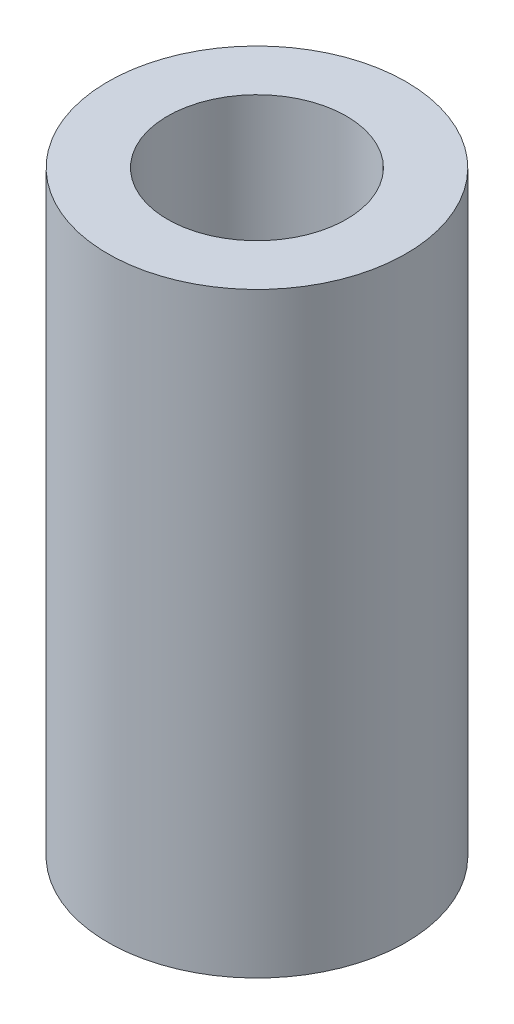
ISO-10303-21;
HEADER;
FILE_DESCRIPTION(('STEP AP214'),'2;1');
FILE_NAME('part.step','',(''),(''),'','','');
FILE_SCHEMA(('AUTOMOTIVE_DESIGN { 1 0 10303 214 1 1 1 1 }'));
ENDSEC;
DATA;
#1=APPLICATION_CONTEXT('core data for automotive mechanical design processes');
#2=APPLICATION_PROTOCOL_DEFINITION('international standard','automotive_design',2000,#1);
#3=PRODUCT_CONTEXT('',#1,'mechanical');
#4=PRODUCT('Part','Part','',(#3));
#5=PRODUCT_RELATED_PRODUCT_CATEGORY('part','',(#4));
#6=PRODUCT_DEFINITION_FORMATION('','',#4);
#7=PRODUCT_DEFINITION_CONTEXT('part definition',#1,'design');
#8=PRODUCT_DEFINITION('design','',#6,#7);
#9=PRODUCT_DEFINITION_SHAPE('','',#8);
#10=(LENGTH_UNIT() NAMED_UNIT(*) SI_UNIT(.MILLI.,.METRE.));
#11=(NAMED_UNIT(*) PLANE_ANGLE_UNIT() SI_UNIT($,.RADIAN.));
#12=(NAMED_UNIT(*) SI_UNIT($,.STERADIAN.) SOLID_ANGLE_UNIT());
#13=UNCERTAINTY_MEASURE_WITH_UNIT(LENGTH_MEASURE(1.E-05),#10,'distance_accuracy_value','');
#14=(GEOMETRIC_REPRESENTATION_CONTEXT(3) GLOBAL_UNCERTAINTY_ASSIGNED_CONTEXT((#13)) GLOBAL_UNIT_ASSIGNED_CONTEXT((#10,
#11,#12)) REPRESENTATION_CONTEXT('',''));
#15=CARTESIAN_POINT('',(0.,0.,0.));
#16=DIRECTION('',(0.,0.,1.));
#17=DIRECTION('',(1.,0.,0.));
#18=AXIS2_PLACEMENT_3D('',#15,#16,#17);
#19=CARTESIAN_POINT('',(0.,0.,0.));
#20=DIRECTION('',(0.,-1.,0.));
#21=DIRECTION('',(0.,0.,-1.));
#22=AXIS2_PLACEMENT_3D('',#19,#20,#21);
#23=CYLINDRICAL_SURFACE('',#22,1.5);
#24=CARTESIAN_POINT('',(0.,10.,0.));
#25=DIRECTION('',(0.,-1.,0.));
#26=DIRECTION('',(0.,0.,-1.));
#27=AXIS2_PLACEMENT_3D('',#24,#25,#26);
#28=CIRCLE('',#27,1.5);
#29=CARTESIAN_POINT('',(0.,10.,-1.5));
#30=VERTEX_POINT('',#29);
#31=EDGE_CURVE('E10',#30,#30,#28,.T.);
#32=ORIENTED_EDGE('',*,*,#31,.F.);
#33=EDGE_LOOP('',(#32));
#34=FACE_BOUND('',#33,.T.);
#35=CARTESIAN_POINT('',(0.,0.,0.));
#36=DIRECTION('',(0.,-1.,0.));
#37=DIRECTION('',(0.,0.,-1.));
#38=AXIS2_PLACEMENT_3D('',#35,#36,#37);
#39=CIRCLE('',#38,1.5);
#40=CARTESIAN_POINT('',(0.,0.,-1.5));
#41=VERTEX_POINT('',#40);
#42=EDGE_CURVE('E44',#41,#41,#39,.T.);
#43=ORIENTED_EDGE('',*,*,#42,.T.);
#44=EDGE_LOOP('',(#43));
#45=FACE_BOUND('',#44,.T.);
#46=ADVANCED_FACE('F30',(#34,#45),#23,.F.);
#47=CARTESIAN_POINT('',(-1.5,10.,0.));
#48=DIRECTION('',(0.,-1.,0.));
#49=DIRECTION('',(0.,0.,-1.));
#50=AXIS2_PLACEMENT_3D('',#47,#48,#49);
#51=PLANE('',#50);
#52=CARTESIAN_POINT('',(0.,10.,0.));
#53=DIRECTION('',(0.,-1.,0.));
#54=DIRECTION('',(0.,0.,-1.));
#55=AXIS2_PLACEMENT_3D('',#52,#53,#54);
#56=CIRCLE('',#55,2.5);
#57=CARTESIAN_POINT('',(0.,10.,-2.5));
#58=VERTEX_POINT('',#57);
#59=EDGE_CURVE('E36',#58,#58,#56,.T.);
#60=ORIENTED_EDGE('',*,*,#59,.F.);
#61=EDGE_LOOP('',(#60));
#62=FACE_BOUND('',#61,.T.);
#63=ORIENTED_EDGE('',*,*,#31,.T.);
#64=EDGE_LOOP('',(#63));
#65=FACE_BOUND('',#64,.T.);
#66=ADVANCED_FACE('F59',(#62,#65),#51,.F.);
#67=CARTESIAN_POINT('',(0.,0.,0.));
#68=DIRECTION('',(0.,-1.,0.));
#69=DIRECTION('',(0.,0.,-1.));
#70=AXIS2_PLACEMENT_3D('',#67,#68,#69);
#71=CYLINDRICAL_SURFACE('',#70,2.5);
#72=CARTESIAN_POINT('',(0.,0.,0.));
#73=DIRECTION('',(0.,-1.,0.));
#74=DIRECTION('',(0.,0.,-1.));
#75=AXIS2_PLACEMENT_3D('',#72,#73,#74);
#76=CIRCLE('',#75,2.5);
#77=CARTESIAN_POINT('',(0.,0.,-2.5));
#78=VERTEX_POINT('',#77);
#79=EDGE_CURVE('E40',#78,#78,#76,.T.);
#80=ORIENTED_EDGE('',*,*,#79,.F.);
#81=EDGE_LOOP('',(#80));
#82=FACE_BOUND('',#81,.T.);
#83=ORIENTED_EDGE('',*,*,#59,.T.);
#84=EDGE_LOOP('',(#83));
#85=FACE_BOUND('',#84,.T.);
#86=ADVANCED_FACE('F54',(#82,#85),#71,.T.);
#87=CARTESIAN_POINT('',(-1.5,0.,0.));
#88=DIRECTION('',(0.,1.,0.));
#89=DIRECTION('',(0.,0.,1.));
#90=AXIS2_PLACEMENT_3D('',#87,#88,#89);
#91=PLANE('',#90);
#92=ORIENTED_EDGE('',*,*,#42,.F.);
#93=EDGE_LOOP('',(#92));
#94=FACE_BOUND('',#93,.T.);
#95=ORIENTED_EDGE('',*,*,#79,.T.);
#96=EDGE_LOOP('',(#95));
#97=FACE_BOUND('',#96,.T.);
#98=ADVANCED_FACE('F51',(#94,#97),#91,.F.);
#99=CLOSED_SHELL('',(#46,#66,#86,#98));
#100=MANIFOLD_SOLID_BREP('B2',#99);
#101=ADVANCED_BREP_SHAPE_REPRESENTATION('',(#18,#100),#14);
#102=SHAPE_DEFINITION_REPRESENTATION(#9,#101);
ENDSEC;
END-ISO-10303-21;
